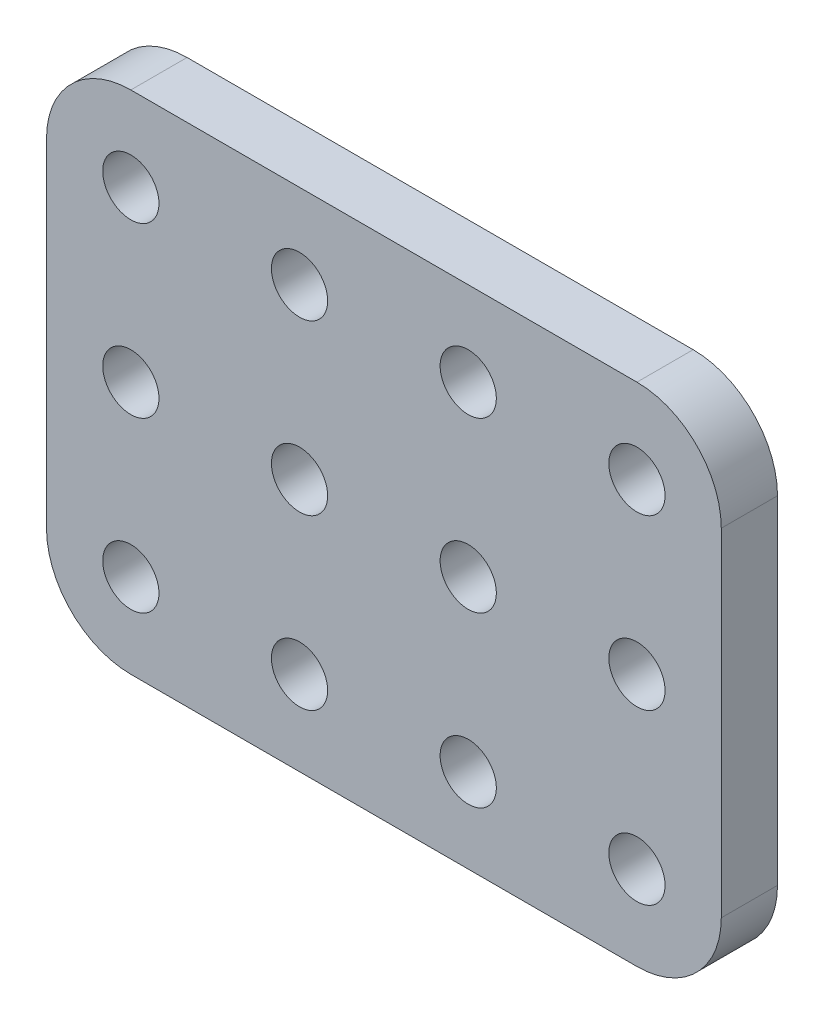
ISO-10303-21;
HEADER;
FILE_DESCRIPTION(('STEP AP214'),'2;1');
FILE_NAME('part.step','',(''),(''),'','','');
FILE_SCHEMA(('AUTOMOTIVE_DESIGN { 1 0 10303 214 1 1 1 1 }'));
ENDSEC;
DATA;
#1=APPLICATION_CONTEXT('core data for automotive mechanical design processes');
#2=APPLICATION_PROTOCOL_DEFINITION('international standard','automotive_design',2000,#1);
#3=PRODUCT_CONTEXT('',#1,'mechanical');
#4=PRODUCT('Part','Part','',(#3));
#5=PRODUCT_RELATED_PRODUCT_CATEGORY('part','',(#4));
#6=PRODUCT_DEFINITION_FORMATION('','',#4);
#7=PRODUCT_DEFINITION_CONTEXT('part definition',#1,'design');
#8=PRODUCT_DEFINITION('design','',#6,#7);
#9=PRODUCT_DEFINITION_SHAPE('','',#8);
#10=(LENGTH_UNIT() NAMED_UNIT(*) SI_UNIT(.MILLI.,.METRE.));
#11=(NAMED_UNIT(*) PLANE_ANGLE_UNIT() SI_UNIT($,.RADIAN.));
#12=(NAMED_UNIT(*) SI_UNIT($,.STERADIAN.) SOLID_ANGLE_UNIT());
#13=UNCERTAINTY_MEASURE_WITH_UNIT(LENGTH_MEASURE(1.E-05),#10,'distance_accuracy_value','');
#14=(GEOMETRIC_REPRESENTATION_CONTEXT(3) GLOBAL_UNCERTAINTY_ASSIGNED_CONTEXT((#13)) GLOBAL_UNIT_ASSIGNED_CONTEXT((#10,
#11,#12)) REPRESENTATION_CONTEXT('',''));
#15=CARTESIAN_POINT('',(0.,0.,0.));
#16=DIRECTION('',(0.,0.,1.));
#17=DIRECTION('',(1.,0.,0.));
#18=AXIS2_PLACEMENT_3D('',#15,#16,#17);
#19=CARTESIAN_POINT('',(-101.443383637,92.056539338,3.));
#20=DIRECTION('',(0.,0.,1.));
#21=DIRECTION('',(1.,0.,0.));
#22=AXIS2_PLACEMENT_3D('',#19,#20,#21);
#23=PLANE('',#22);
#24=CARTESIAN_POINT('',(-83.443383637,74.056539338,3.));
#25=DIRECTION('',(0.,0.,1.));
#26=DIRECTION('',(1.,0.,0.));
#27=AXIS2_PLACEMENT_3D('',#24,#25,#26);
#28=CIRCLE('',#27,1.5);
#29=CARTESIAN_POINT('',(-81.943383637,74.056539338,3.));
#30=VERTEX_POINT('',#29);
#31=EDGE_CURVE('E236',#30,#30,#28,.T.);
#32=ORIENTED_EDGE('',*,*,#31,.F.);
#33=EDGE_LOOP('',(#32));
#34=FACE_BOUND('',#33,.T.);
#35=CARTESIAN_POINT('',(-101.443383637,74.056539338,3.));
#36=DIRECTION('',(0.,0.,1.));
#37=DIRECTION('',(1.,0.,0.));
#38=AXIS2_PLACEMENT_3D('',#35,#36,#37);
#39=CIRCLE('',#38,1.5);
#40=CARTESIAN_POINT('',(-99.943383637,74.056539338,3.));
#41=VERTEX_POINT('',#40);
#42=EDGE_CURVE('E224',#41,#41,#39,.T.);
#43=ORIENTED_EDGE('',*,*,#42,.F.);
#44=EDGE_LOOP('',(#43));
#45=FACE_BOUND('',#44,.T.);
#46=CARTESIAN_POINT('',(-83.443383637,83.056539338,3.));
#47=DIRECTION('',(0.,0.,1.));
#48=DIRECTION('',(1.,0.,0.));
#49=AXIS2_PLACEMENT_3D('',#46,#47,#48);
#50=CIRCLE('',#49,1.5);
#51=CARTESIAN_POINT('',(-81.943383637,83.056539338,3.));
#52=VERTEX_POINT('',#51);
#53=EDGE_CURVE('E212',#52,#52,#50,.T.);
#54=ORIENTED_EDGE('',*,*,#53,.F.);
#55=EDGE_LOOP('',(#54));
#56=FACE_BOUND('',#55,.T.);
#57=CARTESIAN_POINT('',(-101.443383637,83.056539338,3.));
#58=DIRECTION('',(0.,0.,1.));
#59=DIRECTION('',(1.,0.,0.));
#60=AXIS2_PLACEMENT_3D('',#57,#58,#59);
#61=CIRCLE('',#60,1.5);
#62=CARTESIAN_POINT('',(-99.943383637,83.056539338,3.));
#63=VERTEX_POINT('',#62);
#64=EDGE_CURVE('E200',#63,#63,#61,.T.);
#65=ORIENTED_EDGE('',*,*,#64,.F.);
#66=EDGE_LOOP('',(#65));
#67=FACE_BOUND('',#66,.T.);
#68=CARTESIAN_POINT('',(-83.443383637,92.056539338,3.));
#69=DIRECTION('',(0.,0.,1.));
#70=DIRECTION('',(1.,0.,0.));
#71=AXIS2_PLACEMENT_3D('',#68,#69,#70);
#72=CIRCLE('',#71,1.5);
#73=CARTESIAN_POINT('',(-81.943383637,92.056539338,3.));
#74=VERTEX_POINT('',#73);
#75=EDGE_CURVE('E188',#74,#74,#72,.T.);
#76=ORIENTED_EDGE('',*,*,#75,.F.);
#77=EDGE_LOOP('',(#76));
#78=FACE_BOUND('',#77,.T.);
#79=CARTESIAN_POINT('',(-101.443383637,92.056539338,3.));
#80=DIRECTION('',(0.,0.,1.));
#81=DIRECTION('',(1.,0.,0.));
#82=AXIS2_PLACEMENT_3D('',#79,#80,#81);
#83=CIRCLE('',#82,1.5);
#84=CARTESIAN_POINT('',(-99.943383637,92.056539338,3.));
#85=VERTEX_POINT('',#84);
#86=EDGE_CURVE('E134',#85,#85,#83,.T.);
#87=ORIENTED_EDGE('',*,*,#86,.F.);
#88=EDGE_LOOP('',(#87));
#89=FACE_BOUND('',#88,.T.);
#90=CARTESIAN_POINT('',(-101.443383637,92.056539338,3.));
#91=DIRECTION('',(0.,0.,1.));
#92=DIRECTION('',(1.,0.,0.));
#93=AXIS2_PLACEMENT_3D('',#90,#91,#92);
#94=CIRCLE('',#93,4.5);
#95=CARTESIAN_POINT('',(-101.443383637,96.556539338,3.));
#96=VERTEX_POINT('',#95);
#97=CARTESIAN_POINT('',(-105.943383637,92.056539338,3.));
#98=VERTEX_POINT('',#97);
#99=EDGE_CURVE('E145',#96,#98,#94,.T.);
#100=ORIENTED_EDGE('',*,*,#99,.T.);
#101=DIRECTION('',(0.,-1.,0.));
#102=VECTOR('',#101,1.);
#103=CARTESIAN_POINT('',(-105.943383637,92.056539338,3.));
#104=LINE('',#103,#102);
#105=CARTESIAN_POINT('',(-105.943383637,74.056539338,3.));
#106=VERTEX_POINT('',#105);
#107=EDGE_CURVE('E93',#98,#106,#104,.T.);
#108=ORIENTED_EDGE('',*,*,#107,.T.);
#109=CARTESIAN_POINT('',(-101.443383637,74.056539338,3.));
#110=DIRECTION('',(0.,0.,1.));
#111=DIRECTION('',(1.,0.,0.));
#112=AXIS2_PLACEMENT_3D('',#109,#110,#111);
#113=CIRCLE('',#112,4.5);
#114=CARTESIAN_POINT('',(-101.443383637,69.556539338,3.));
#115=VERTEX_POINT('',#114);
#116=EDGE_CURVE('E160',#106,#115,#113,.T.);
#117=ORIENTED_EDGE('',*,*,#116,.T.);
#118=DIRECTION('',(1.,0.,0.));
#119=VECTOR('',#118,1.);
#120=CARTESIAN_POINT('',(-101.443383637,69.556539338,3.));
#121=LINE('',#120,#119);
#122=CARTESIAN_POINT('',(-74.443383637,69.556539338,3.));
#123=VERTEX_POINT('',#122);
#124=EDGE_CURVE('E173',#115,#123,#121,.T.);
#125=ORIENTED_EDGE('',*,*,#124,.T.);
#126=CARTESIAN_POINT('',(-74.443383637,74.056539338,3.));
#127=DIRECTION('',(0.,0.,1.));
#128=DIRECTION('',(1.,0.,0.));
#129=AXIS2_PLACEMENT_3D('',#126,#127,#128);
#130=CIRCLE('',#129,4.5);
#131=CARTESIAN_POINT('',(-69.943383637,74.056539338,3.));
#132=VERTEX_POINT('',#131);
#133=EDGE_CURVE('E112',#123,#132,#130,.T.);
#134=ORIENTED_EDGE('',*,*,#133,.T.);
#135=DIRECTION('',(0.,1.,0.));
#136=VECTOR('',#135,1.);
#137=CARTESIAN_POINT('',(-69.943383637,74.056539338,3.));
#138=LINE('',#137,#136);
#139=CARTESIAN_POINT('',(-69.943383637,92.056539338,3.));
#140=VERTEX_POINT('',#139);
#141=EDGE_CURVE('E106',#132,#140,#138,.T.);
#142=ORIENTED_EDGE('',*,*,#141,.T.);
#143=CARTESIAN_POINT('',(-74.443383637,92.056539338,3.));
#144=DIRECTION('',(0.,0.,1.));
#145=DIRECTION('',(1.,0.,0.));
#146=AXIS2_PLACEMENT_3D('',#143,#144,#145);
#147=CIRCLE('',#146,4.5);
#148=CARTESIAN_POINT('',(-74.443383637,96.556539338,3.));
#149=VERTEX_POINT('',#148);
#150=EDGE_CURVE('E110',#140,#149,#147,.T.);
#151=ORIENTED_EDGE('',*,*,#150,.T.);
#152=DIRECTION('',(-1.,0.,0.));
#153=VECTOR('',#152,1.);
#154=CARTESIAN_POINT('',(-74.443383637,96.556539338,3.));
#155=LINE('',#154,#153);
#156=EDGE_CURVE('E50',#149,#96,#155,.T.);
#157=ORIENTED_EDGE('',*,*,#156,.T.);
#158=EDGE_LOOP('',(#100,#108,#117,#125,#134,#142,#151,#157));
#159=FACE_BOUND('',#158,.T.);
#160=CARTESIAN_POINT('',(-92.443383637,92.056539338,3.));
#161=DIRECTION('',(0.,0.,1.));
#162=DIRECTION('',(1.,0.,0.));
#163=AXIS2_PLACEMENT_3D('',#160,#161,#162);
#164=CIRCLE('',#163,1.5);
#165=CARTESIAN_POINT('',(-90.943383637,92.056539338,3.));
#166=VERTEX_POINT('',#165);
#167=EDGE_CURVE('E182',#166,#166,#164,.T.);
#168=ORIENTED_EDGE('',*,*,#167,.F.);
#169=EDGE_LOOP('',(#168));
#170=FACE_BOUND('',#169,.T.);
#171=CARTESIAN_POINT('',(-74.443383637,92.056539338,3.));
#172=DIRECTION('',(0.,0.,1.));
#173=DIRECTION('',(1.,0.,0.));
#174=AXIS2_PLACEMENT_3D('',#171,#172,#173);
#175=CIRCLE('',#174,1.5);
#176=CARTESIAN_POINT('',(-72.943383637,92.056539338,3.));
#177=VERTEX_POINT('',#176);
#178=EDGE_CURVE('E194',#177,#177,#175,.T.);
#179=ORIENTED_EDGE('',*,*,#178,.F.);
#180=EDGE_LOOP('',(#179));
#181=FACE_BOUND('',#180,.T.);
#182=CARTESIAN_POINT('',(-92.443383637,83.056539338,3.));
#183=DIRECTION('',(0.,0.,1.));
#184=DIRECTION('',(1.,0.,0.));
#185=AXIS2_PLACEMENT_3D('',#182,#183,#184);
#186=CIRCLE('',#185,1.5);
#187=CARTESIAN_POINT('',(-90.943383637,83.056539338,3.));
#188=VERTEX_POINT('',#187);
#189=EDGE_CURVE('E206',#188,#188,#186,.T.);
#190=ORIENTED_EDGE('',*,*,#189,.F.);
#191=EDGE_LOOP('',(#190));
#192=FACE_BOUND('',#191,.T.);
#193=CARTESIAN_POINT('',(-74.443383637,83.056539338,3.));
#194=DIRECTION('',(0.,0.,1.));
#195=DIRECTION('',(1.,0.,0.));
#196=AXIS2_PLACEMENT_3D('',#193,#194,#195);
#197=CIRCLE('',#196,1.5);
#198=CARTESIAN_POINT('',(-72.943383637,83.056539338,3.));
#199=VERTEX_POINT('',#198);
#200=EDGE_CURVE('E218',#199,#199,#197,.T.);
#201=ORIENTED_EDGE('',*,*,#200,.F.);
#202=EDGE_LOOP('',(#201));
#203=FACE_BOUND('',#202,.T.);
#204=CARTESIAN_POINT('',(-92.443383637,74.056539338,3.));
#205=DIRECTION('',(0.,0.,1.));
#206=DIRECTION('',(1.,0.,0.));
#207=AXIS2_PLACEMENT_3D('',#204,#205,#206);
#208=CIRCLE('',#207,1.5);
#209=CARTESIAN_POINT('',(-90.943383637,74.056539338,3.));
#210=VERTEX_POINT('',#209);
#211=EDGE_CURVE('E230',#210,#210,#208,.T.);
#212=ORIENTED_EDGE('',*,*,#211,.F.);
#213=EDGE_LOOP('',(#212));
#214=FACE_BOUND('',#213,.T.);
#215=CARTESIAN_POINT('',(-74.443383637,74.056539338,3.));
#216=DIRECTION('',(0.,0.,1.));
#217=DIRECTION('',(1.,0.,0.));
#218=AXIS2_PLACEMENT_3D('',#215,#216,#217);
#219=CIRCLE('',#218,1.5);
#220=CARTESIAN_POINT('',(-72.943383637,74.056539338,3.));
#221=VERTEX_POINT('',#220);
#222=EDGE_CURVE('E242',#221,#221,#219,.T.);
#223=ORIENTED_EDGE('',*,*,#222,.F.);
#224=EDGE_LOOP('',(#223));
#225=FACE_BOUND('',#224,.T.);
#226=ADVANCED_FACE('F33',(#34,#45,#56,#67,#78,#89,#159,#170,#181,#192,#203,#214,#225),#23,.T.);
#227=CARTESIAN_POINT('',(-101.443383637,92.056539338,0.));
#228=DIRECTION('',(0.,0.,1.));
#229=DIRECTION('',(1.,0.,0.));
#230=AXIS2_PLACEMENT_3D('',#227,#228,#229);
#231=PLANE('',#230);
#232=CARTESIAN_POINT('',(-83.443383637,74.056539338,0.));
#233=DIRECTION('',(0.,0.,1.));
#234=DIRECTION('',(1.,0.,0.));
#235=AXIS2_PLACEMENT_3D('',#232,#233,#234);
#236=CIRCLE('',#235,1.5);
#237=CARTESIAN_POINT('',(-81.943383637,74.056539338,0.));
#238=VERTEX_POINT('',#237);
#239=EDGE_CURVE('E239',#238,#238,#236,.T.);
#240=ORIENTED_EDGE('',*,*,#239,.T.);
#241=EDGE_LOOP('',(#240));
#242=FACE_BOUND('',#241,.T.);
#243=CARTESIAN_POINT('',(-101.443383637,74.056539338,0.));
#244=DIRECTION('',(0.,0.,1.));
#245=DIRECTION('',(1.,0.,0.));
#246=AXIS2_PLACEMENT_3D('',#243,#244,#245);
#247=CIRCLE('',#246,1.5);
#248=CARTESIAN_POINT('',(-99.943383637,74.056539338,0.));
#249=VERTEX_POINT('',#248);
#250=EDGE_CURVE('E227',#249,#249,#247,.T.);
#251=ORIENTED_EDGE('',*,*,#250,.T.);
#252=EDGE_LOOP('',(#251));
#253=FACE_BOUND('',#252,.T.);
#254=CARTESIAN_POINT('',(-83.443383637,83.056539338,0.));
#255=DIRECTION('',(0.,0.,1.));
#256=DIRECTION('',(1.,0.,0.));
#257=AXIS2_PLACEMENT_3D('',#254,#255,#256);
#258=CIRCLE('',#257,1.5);
#259=CARTESIAN_POINT('',(-81.943383637,83.056539338,0.));
#260=VERTEX_POINT('',#259);
#261=EDGE_CURVE('E215',#260,#260,#258,.T.);
#262=ORIENTED_EDGE('',*,*,#261,.T.);
#263=EDGE_LOOP('',(#262));
#264=FACE_BOUND('',#263,.T.);
#265=CARTESIAN_POINT('',(-101.443383637,83.056539338,0.));
#266=DIRECTION('',(0.,0.,1.));
#267=DIRECTION('',(1.,0.,0.));
#268=AXIS2_PLACEMENT_3D('',#265,#266,#267);
#269=CIRCLE('',#268,1.5);
#270=CARTESIAN_POINT('',(-99.943383637,83.056539338,0.));
#271=VERTEX_POINT('',#270);
#272=EDGE_CURVE('E203',#271,#271,#269,.T.);
#273=ORIENTED_EDGE('',*,*,#272,.T.);
#274=EDGE_LOOP('',(#273));
#275=FACE_BOUND('',#274,.T.);
#276=CARTESIAN_POINT('',(-83.443383637,92.056539338,0.));
#277=DIRECTION('',(0.,0.,1.));
#278=DIRECTION('',(1.,0.,0.));
#279=AXIS2_PLACEMENT_3D('',#276,#277,#278);
#280=CIRCLE('',#279,1.5);
#281=CARTESIAN_POINT('',(-81.943383637,92.056539338,0.));
#282=VERTEX_POINT('',#281);
#283=EDGE_CURVE('E191',#282,#282,#280,.T.);
#284=ORIENTED_EDGE('',*,*,#283,.T.);
#285=EDGE_LOOP('',(#284));
#286=FACE_BOUND('',#285,.T.);
#287=CARTESIAN_POINT('',(-101.443383637,92.056539338,0.));
#288=DIRECTION('',(0.,0.,1.));
#289=DIRECTION('',(1.,0.,0.));
#290=AXIS2_PLACEMENT_3D('',#287,#288,#289);
#291=CIRCLE('',#290,1.5);
#292=CARTESIAN_POINT('',(-99.943383637,92.056539338,0.));
#293=VERTEX_POINT('',#292);
#294=EDGE_CURVE('E179',#293,#293,#291,.T.);
#295=ORIENTED_EDGE('',*,*,#294,.T.);
#296=EDGE_LOOP('',(#295));
#297=FACE_BOUND('',#296,.T.);
#298=CARTESIAN_POINT('',(-101.443383637,92.056539338,0.));
#299=DIRECTION('',(0.,0.,1.));
#300=DIRECTION('',(1.,0.,0.));
#301=AXIS2_PLACEMENT_3D('',#298,#299,#300);
#302=CIRCLE('',#301,4.5);
#303=CARTESIAN_POINT('',(-101.443383637,96.556539338,0.));
#304=VERTEX_POINT('',#303);
#305=CARTESIAN_POINT('',(-105.943383637,92.056539338,0.));
#306=VERTEX_POINT('',#305);
#307=EDGE_CURVE('E130',#304,#306,#302,.T.);
#308=ORIENTED_EDGE('',*,*,#307,.F.);
#309=DIRECTION('',(-1.,0.,0.));
#310=VECTOR('',#309,1.);
#311=CARTESIAN_POINT('',(-74.443383637,96.556539338,0.));
#312=LINE('',#311,#310);
#313=CARTESIAN_POINT('',(-74.443383637,96.556539338,0.));
#314=VERTEX_POINT('',#313);
#315=EDGE_CURVE('E85',#314,#304,#312,.T.);
#316=ORIENTED_EDGE('',*,*,#315,.F.);
#317=CARTESIAN_POINT('',(-74.443383637,92.056539338,0.));
#318=DIRECTION('',(0.,0.,1.));
#319=DIRECTION('',(1.,0.,0.));
#320=AXIS2_PLACEMENT_3D('',#317,#318,#319);
#321=CIRCLE('',#320,4.5);
#322=CARTESIAN_POINT('',(-69.943383637,92.056539338,0.));
#323=VERTEX_POINT('',#322);
#324=EDGE_CURVE('E79',#323,#314,#321,.T.);
#325=ORIENTED_EDGE('',*,*,#324,.F.);
#326=DIRECTION('',(0.,1.,0.));
#327=VECTOR('',#326,1.);
#328=CARTESIAN_POINT('',(-69.943383637,74.056539338,0.));
#329=LINE('',#328,#327);
#330=CARTESIAN_POINT('',(-69.943383637,74.056539338,0.));
#331=VERTEX_POINT('',#330);
#332=EDGE_CURVE('E120',#331,#323,#329,.T.);
#333=ORIENTED_EDGE('',*,*,#332,.F.);
#334=CARTESIAN_POINT('',(-74.443383637,74.056539338,0.));
#335=DIRECTION('',(0.,0.,1.));
#336=DIRECTION('',(1.,0.,0.));
#337=AXIS2_PLACEMENT_3D('',#334,#335,#336);
#338=CIRCLE('',#337,4.5);
#339=CARTESIAN_POINT('',(-74.443383637,69.556539338,0.));
#340=VERTEX_POINT('',#339);
#341=EDGE_CURVE('E140',#340,#331,#338,.T.);
#342=ORIENTED_EDGE('',*,*,#341,.F.);
#343=DIRECTION('',(1.,0.,0.));
#344=VECTOR('',#343,1.);
#345=CARTESIAN_POINT('',(-101.443383637,69.556539338,0.));
#346=LINE('',#345,#344);
#347=CARTESIAN_POINT('',(-101.443383637,69.556539338,0.));
#348=VERTEX_POINT('',#347);
#349=EDGE_CURVE('E138',#348,#340,#346,.T.);
#350=ORIENTED_EDGE('',*,*,#349,.F.);
#351=CARTESIAN_POINT('',(-101.443383637,74.056539338,0.));
#352=DIRECTION('',(0.,0.,1.));
#353=DIRECTION('',(1.,0.,0.));
#354=AXIS2_PLACEMENT_3D('',#351,#352,#353);
#355=CIRCLE('',#354,4.5);
#356=CARTESIAN_POINT('',(-105.943383637,74.056539338,0.));
#357=VERTEX_POINT('',#356);
#358=EDGE_CURVE('E136',#357,#348,#355,.T.);
#359=ORIENTED_EDGE('',*,*,#358,.F.);
#360=DIRECTION('',(0.,-1.,0.));
#361=VECTOR('',#360,1.);
#362=CARTESIAN_POINT('',(-105.943383637,92.056539338,0.));
#363=LINE('',#362,#361);
#364=EDGE_CURVE('E133',#306,#357,#363,.T.);
#365=ORIENTED_EDGE('',*,*,#364,.F.);
#366=EDGE_LOOP('',(#308,#316,#325,#333,#342,#350,#359,#365));
#367=FACE_BOUND('',#366,.T.);
#368=CARTESIAN_POINT('',(-92.443383637,92.056539338,0.));
#369=DIRECTION('',(0.,0.,1.));
#370=DIRECTION('',(1.,0.,0.));
#371=AXIS2_PLACEMENT_3D('',#368,#369,#370);
#372=CIRCLE('',#371,1.5);
#373=CARTESIAN_POINT('',(-90.943383637,92.056539338,0.));
#374=VERTEX_POINT('',#373);
#375=EDGE_CURVE('E185',#374,#374,#372,.T.);
#376=ORIENTED_EDGE('',*,*,#375,.T.);
#377=EDGE_LOOP('',(#376));
#378=FACE_BOUND('',#377,.T.);
#379=CARTESIAN_POINT('',(-74.443383637,92.056539338,0.));
#380=DIRECTION('',(0.,0.,1.));
#381=DIRECTION('',(1.,0.,0.));
#382=AXIS2_PLACEMENT_3D('',#379,#380,#381);
#383=CIRCLE('',#382,1.5);
#384=CARTESIAN_POINT('',(-72.943383637,92.056539338,0.));
#385=VERTEX_POINT('',#384);
#386=EDGE_CURVE('E197',#385,#385,#383,.T.);
#387=ORIENTED_EDGE('',*,*,#386,.T.);
#388=EDGE_LOOP('',(#387));
#389=FACE_BOUND('',#388,.T.);
#390=CARTESIAN_POINT('',(-92.443383637,83.056539338,0.));
#391=DIRECTION('',(0.,0.,1.));
#392=DIRECTION('',(1.,0.,0.));
#393=AXIS2_PLACEMENT_3D('',#390,#391,#392);
#394=CIRCLE('',#393,1.5);
#395=CARTESIAN_POINT('',(-90.943383637,83.056539338,0.));
#396=VERTEX_POINT('',#395);
#397=EDGE_CURVE('E209',#396,#396,#394,.T.);
#398=ORIENTED_EDGE('',*,*,#397,.T.);
#399=EDGE_LOOP('',(#398));
#400=FACE_BOUND('',#399,.T.);
#401=CARTESIAN_POINT('',(-74.443383637,83.056539338,0.));
#402=DIRECTION('',(0.,0.,1.));
#403=DIRECTION('',(1.,0.,0.));
#404=AXIS2_PLACEMENT_3D('',#401,#402,#403);
#405=CIRCLE('',#404,1.5);
#406=CARTESIAN_POINT('',(-72.943383637,83.056539338,0.));
#407=VERTEX_POINT('',#406);
#408=EDGE_CURVE('E221',#407,#407,#405,.T.);
#409=ORIENTED_EDGE('',*,*,#408,.T.);
#410=EDGE_LOOP('',(#409));
#411=FACE_BOUND('',#410,.T.);
#412=CARTESIAN_POINT('',(-92.443383637,74.056539338,0.));
#413=DIRECTION('',(0.,0.,1.));
#414=DIRECTION('',(1.,0.,0.));
#415=AXIS2_PLACEMENT_3D('',#412,#413,#414);
#416=CIRCLE('',#415,1.5);
#417=CARTESIAN_POINT('',(-90.943383637,74.056539338,0.));
#418=VERTEX_POINT('',#417);
#419=EDGE_CURVE('E233',#418,#418,#416,.T.);
#420=ORIENTED_EDGE('',*,*,#419,.T.);
#421=EDGE_LOOP('',(#420));
#422=FACE_BOUND('',#421,.T.);
#423=CARTESIAN_POINT('',(-74.443383637,74.056539338,0.));
#424=DIRECTION('',(0.,0.,1.));
#425=DIRECTION('',(1.,0.,0.));
#426=AXIS2_PLACEMENT_3D('',#423,#424,#425);
#427=CIRCLE('',#426,1.5);
#428=CARTESIAN_POINT('',(-72.943383637,74.056539338,0.));
#429=VERTEX_POINT('',#428);
#430=EDGE_CURVE('E245',#429,#429,#427,.T.);
#431=ORIENTED_EDGE('',*,*,#430,.T.);
#432=EDGE_LOOP('',(#431));
#433=FACE_BOUND('',#432,.T.);
#434=ADVANCED_FACE('F164',(#242,#253,#264,#275,#286,#297,#367,#378,#389,#400,#411,#422,#433),
#231,.F.);
#435=CARTESIAN_POINT('',(-101.443383637,92.056539338,3.));
#436=DIRECTION('',(0.,0.,-1.));
#437=DIRECTION('',(-1.,0.,0.));
#438=AXIS2_PLACEMENT_3D('',#435,#436,#437);
#439=CYLINDRICAL_SURFACE('',#438,4.5);
#440=ORIENTED_EDGE('',*,*,#307,.T.);
#441=DIRECTION('',(0.,0.,-1.));
#442=VECTOR('',#441,1.);
#443=CARTESIAN_POINT('',(-105.943383637,92.056539338,3.));
#444=LINE('',#443,#442);
#445=EDGE_CURVE('E11',#98,#306,#444,.T.);
#446=ORIENTED_EDGE('',*,*,#445,.F.);
#447=ORIENTED_EDGE('',*,*,#99,.F.);
#448=DIRECTION('',(0.,0.,-1.));
#449=VECTOR('',#448,1.);
#450=CARTESIAN_POINT('',(-101.443383637,96.556539338,3.));
#451=LINE('',#450,#449);
#452=EDGE_CURVE('E126',#96,#304,#451,.T.);
#453=ORIENTED_EDGE('',*,*,#452,.T.);
#454=EDGE_LOOP('',(#440,#446,#447,#453));
#455=FACE_BOUND('',#454,.T.);
#456=ADVANCED_FACE('F35',(#455),#439,.T.);
#457=CARTESIAN_POINT('',(-105.943383637,92.056539338,3.));
#458=DIRECTION('',(1.,0.,0.));
#459=DIRECTION('',(0.,0.,-1.));
#460=AXIS2_PLACEMENT_3D('',#457,#458,#459);
#461=PLANE('',#460);
#462=ORIENTED_EDGE('',*,*,#364,.T.);
#463=DIRECTION('',(0.,0.,-1.));
#464=VECTOR('',#463,1.);
#465=CARTESIAN_POINT('',(-105.943383637,74.056539338,3.));
#466=LINE('',#465,#464);
#467=EDGE_CURVE('E42',#106,#357,#466,.T.);
#468=ORIENTED_EDGE('',*,*,#467,.F.);
#469=ORIENTED_EDGE('',*,*,#107,.F.);
#470=ORIENTED_EDGE('',*,*,#445,.T.);
#471=EDGE_LOOP('',(#462,#468,#469,#470));
#472=FACE_BOUND('',#471,.T.);
#473=ADVANCED_FACE('F280',(#472),#461,.F.);
#474=CARTESIAN_POINT('',(-101.443383637,74.056539338,3.));
#475=DIRECTION('',(0.,0.,-1.));
#476=DIRECTION('',(-1.,0.,0.));
#477=AXIS2_PLACEMENT_3D('',#474,#475,#476);
#478=CYLINDRICAL_SURFACE('',#477,4.5);
#479=ORIENTED_EDGE('',*,*,#358,.T.);
#480=DIRECTION('',(0.,0.,-1.));
#481=VECTOR('',#480,1.);
#482=CARTESIAN_POINT('',(-101.443383637,69.556539338,3.));
#483=LINE('',#482,#481);
#484=EDGE_CURVE('E152',#115,#348,#483,.T.);
#485=ORIENTED_EDGE('',*,*,#484,.F.);
#486=ORIENTED_EDGE('',*,*,#116,.F.);
#487=ORIENTED_EDGE('',*,*,#467,.T.);
#488=EDGE_LOOP('',(#479,#485,#486,#487));
#489=FACE_BOUND('',#488,.T.);
#490=ADVANCED_FACE('F158',(#489),#478,.T.);
#491=CARTESIAN_POINT('',(-101.443383637,69.556539338,3.));
#492=DIRECTION('',(0.,1.,0.));
#493=DIRECTION('',(0.,0.,1.));
#494=AXIS2_PLACEMENT_3D('',#491,#492,#493);
#495=PLANE('',#494);
#496=ORIENTED_EDGE('',*,*,#349,.T.);
#497=DIRECTION('',(0.,0.,-1.));
#498=VECTOR('',#497,1.);
#499=CARTESIAN_POINT('',(-74.443383637,69.556539338,3.));
#500=LINE('',#499,#498);
#501=EDGE_CURVE('E149',#123,#340,#500,.T.);
#502=ORIENTED_EDGE('',*,*,#501,.F.);
#503=ORIENTED_EDGE('',*,*,#124,.F.);
#504=ORIENTED_EDGE('',*,*,#484,.T.);
#505=EDGE_LOOP('',(#496,#502,#503,#504));
#506=FACE_BOUND('',#505,.T.);
#507=ADVANCED_FACE('F169',(#506),#495,.F.);
#508=CARTESIAN_POINT('',(-74.443383637,74.056539338,3.));
#509=DIRECTION('',(0.,0.,-1.));
#510=DIRECTION('',(-1.,0.,0.));
#511=AXIS2_PLACEMENT_3D('',#508,#509,#510);
#512=CYLINDRICAL_SURFACE('',#511,4.5);
#513=ORIENTED_EDGE('',*,*,#341,.T.);
#514=DIRECTION('',(0.,0.,-1.));
#515=VECTOR('',#514,1.);
#516=CARTESIAN_POINT('',(-69.943383637,74.056539338,3.));
#517=LINE('',#516,#515);
#518=EDGE_CURVE('E121',#132,#331,#517,.T.);
#519=ORIENTED_EDGE('',*,*,#518,.F.);
#520=ORIENTED_EDGE('',*,*,#133,.F.);
#521=ORIENTED_EDGE('',*,*,#501,.T.);
#522=EDGE_LOOP('',(#513,#519,#520,#521));
#523=FACE_BOUND('',#522,.T.);
#524=ADVANCED_FACE('F172',(#523),#512,.T.);
#525=CARTESIAN_POINT('',(-69.943383637,74.056539338,3.));
#526=DIRECTION('',(-1.,0.,0.));
#527=DIRECTION('',(0.,0.,1.));
#528=AXIS2_PLACEMENT_3D('',#525,#526,#527);
#529=PLANE('',#528);
#530=ORIENTED_EDGE('',*,*,#332,.T.);
#531=DIRECTION('',(0.,0.,-1.));
#532=VECTOR('',#531,1.);
#533=CARTESIAN_POINT('',(-69.943383637,92.056539338,3.));
#534=LINE('',#533,#532);
#535=EDGE_CURVE('E117',#140,#323,#534,.T.);
#536=ORIENTED_EDGE('',*,*,#535,.F.);
#537=ORIENTED_EDGE('',*,*,#141,.F.);
#538=ORIENTED_EDGE('',*,*,#518,.T.);
#539=EDGE_LOOP('',(#530,#536,#537,#538));
#540=FACE_BOUND('',#539,.T.);
#541=ADVANCED_FACE('F118',(#540),#529,.F.);
#542=CARTESIAN_POINT('',(-74.443383637,92.056539338,3.));
#543=DIRECTION('',(0.,0.,-1.));
#544=DIRECTION('',(-1.,0.,0.));
#545=AXIS2_PLACEMENT_3D('',#542,#543,#544);
#546=CYLINDRICAL_SURFACE('',#545,4.5);
#547=ORIENTED_EDGE('',*,*,#324,.T.);
#548=DIRECTION('',(0.,0.,-1.));
#549=VECTOR('',#548,1.);
#550=CARTESIAN_POINT('',(-74.443383637,96.556539338,3.));
#551=LINE('',#550,#549);
#552=EDGE_CURVE('E122',#149,#314,#551,.T.);
#553=ORIENTED_EDGE('',*,*,#552,.F.);
#554=ORIENTED_EDGE('',*,*,#150,.F.);
#555=ORIENTED_EDGE('',*,*,#535,.T.);
#556=EDGE_LOOP('',(#547,#553,#554,#555));
#557=FACE_BOUND('',#556,.T.);
#558=ADVANCED_FACE('F124',(#557),#546,.T.);
#559=CARTESIAN_POINT('',(-74.443383637,96.556539338,3.));
#560=DIRECTION('',(0.,-1.,0.));
#561=DIRECTION('',(0.,0.,-1.));
#562=AXIS2_PLACEMENT_3D('',#559,#560,#561);
#563=PLANE('',#562);
#564=ORIENTED_EDGE('',*,*,#315,.T.);
#565=ORIENTED_EDGE('',*,*,#452,.F.);
#566=ORIENTED_EDGE('',*,*,#156,.F.);
#567=ORIENTED_EDGE('',*,*,#552,.T.);
#568=EDGE_LOOP('',(#564,#565,#566,#567));
#569=FACE_BOUND('',#568,.T.);
#570=ADVANCED_FACE('F268',(#569),#563,.F.);
#571=CARTESIAN_POINT('',(-101.443383637,92.056539338,3.));
#572=DIRECTION('',(0.,0.,-1.));
#573=DIRECTION('',(-1.,0.,0.));
#574=AXIS2_PLACEMENT_3D('',#571,#572,#573);
#575=CYLINDRICAL_SURFACE('',#574,1.5);
#576=ORIENTED_EDGE('',*,*,#86,.T.);
#577=EDGE_LOOP('',(#576));
#578=FACE_BOUND('',#577,.T.);
#579=ORIENTED_EDGE('',*,*,#294,.F.);
#580=EDGE_LOOP('',(#579));
#581=FACE_BOUND('',#580,.T.);
#582=ADVANCED_FACE('F265',(#578,#581),#575,.F.);
#583=CARTESIAN_POINT('',(-92.443383637,92.056539338,3.));
#584=DIRECTION('',(0.,0.,-1.));
#585=DIRECTION('',(-1.,0.,0.));
#586=AXIS2_PLACEMENT_3D('',#583,#584,#585);
#587=CYLINDRICAL_SURFACE('',#586,1.5);
#588=ORIENTED_EDGE('',*,*,#167,.T.);
#589=EDGE_LOOP('',(#588));
#590=FACE_BOUND('',#589,.T.);
#591=ORIENTED_EDGE('',*,*,#375,.F.);
#592=EDGE_LOOP('',(#591));
#593=FACE_BOUND('',#592,.T.);
#594=ADVANCED_FACE('F344',(#590,#593),#587,.F.);
#595=CARTESIAN_POINT('',(-83.443383637,92.056539338,3.));
#596=DIRECTION('',(0.,0.,-1.));
#597=DIRECTION('',(-1.,0.,0.));
#598=AXIS2_PLACEMENT_3D('',#595,#596,#597);
#599=CYLINDRICAL_SURFACE('',#598,1.5);
#600=ORIENTED_EDGE('',*,*,#75,.T.);
#601=EDGE_LOOP('',(#600));
#602=FACE_BOUND('',#601,.T.);
#603=ORIENTED_EDGE('',*,*,#283,.F.);
#604=EDGE_LOOP('',(#603));
#605=FACE_BOUND('',#604,.T.);
#606=ADVANCED_FACE('F352',(#602,#605),#599,.F.);
#607=CARTESIAN_POINT('',(-74.443383637,92.056539338,3.));
#608=DIRECTION('',(0.,0.,-1.));
#609=DIRECTION('',(-1.,0.,0.));
#610=AXIS2_PLACEMENT_3D('',#607,#608,#609);
#611=CYLINDRICAL_SURFACE('',#610,1.5);
#612=ORIENTED_EDGE('',*,*,#178,.T.);
#613=EDGE_LOOP('',(#612));
#614=FACE_BOUND('',#613,.T.);
#615=ORIENTED_EDGE('',*,*,#386,.F.);
#616=EDGE_LOOP('',(#615));
#617=FACE_BOUND('',#616,.T.);
#618=ADVANCED_FACE('F360',(#614,#617),#611,.F.);
#619=CARTESIAN_POINT('',(-101.443383637,83.056539338,3.));
#620=DIRECTION('',(0.,0.,-1.));
#621=DIRECTION('',(-1.,0.,0.));
#622=AXIS2_PLACEMENT_3D('',#619,#620,#621);
#623=CYLINDRICAL_SURFACE('',#622,1.5);
#624=ORIENTED_EDGE('',*,*,#64,.T.);
#625=EDGE_LOOP('',(#624));
#626=FACE_BOUND('',#625,.T.);
#627=ORIENTED_EDGE('',*,*,#272,.F.);
#628=EDGE_LOOP('',(#627));
#629=FACE_BOUND('',#628,.T.);
#630=ADVANCED_FACE('F369',(#626,#629),#623,.F.);
#631=CARTESIAN_POINT('',(-92.443383637,83.056539338,3.));
#632=DIRECTION('',(0.,0.,-1.));
#633=DIRECTION('',(-1.,0.,0.));
#634=AXIS2_PLACEMENT_3D('',#631,#632,#633);
#635=CYLINDRICAL_SURFACE('',#634,1.5);
#636=ORIENTED_EDGE('',*,*,#189,.T.);
#637=EDGE_LOOP('',(#636));
#638=FACE_BOUND('',#637,.T.);
#639=ORIENTED_EDGE('',*,*,#397,.F.);
#640=EDGE_LOOP('',(#639));
#641=FACE_BOUND('',#640,.T.);
#642=ADVANCED_FACE('F378',(#638,#641),#635,.F.);
#643=CARTESIAN_POINT('',(-83.443383637,83.056539338,3.));
#644=DIRECTION('',(0.,0.,-1.));
#645=DIRECTION('',(-1.,0.,0.));
#646=AXIS2_PLACEMENT_3D('',#643,#644,#645);
#647=CYLINDRICAL_SURFACE('',#646,1.5);
#648=ORIENTED_EDGE('',*,*,#53,.T.);
#649=EDGE_LOOP('',(#648));
#650=FACE_BOUND('',#649,.T.);
#651=ORIENTED_EDGE('',*,*,#261,.F.);
#652=EDGE_LOOP('',(#651));
#653=FACE_BOUND('',#652,.T.);
#654=ADVANCED_FACE('F387',(#650,#653),#647,.F.);
#655=CARTESIAN_POINT('',(-74.443383637,83.056539338,3.));
#656=DIRECTION('',(0.,0.,-1.));
#657=DIRECTION('',(-1.,0.,0.));
#658=AXIS2_PLACEMENT_3D('',#655,#656,#657);
#659=CYLINDRICAL_SURFACE('',#658,1.5);
#660=ORIENTED_EDGE('',*,*,#200,.T.);
#661=EDGE_LOOP('',(#660));
#662=FACE_BOUND('',#661,.T.);
#663=ORIENTED_EDGE('',*,*,#408,.F.);
#664=EDGE_LOOP('',(#663));
#665=FACE_BOUND('',#664,.T.);
#666=ADVANCED_FACE('F396',(#662,#665),#659,.F.);
#667=CARTESIAN_POINT('',(-101.443383637,74.056539338,3.));
#668=DIRECTION('',(0.,0.,-1.));
#669=DIRECTION('',(-1.,0.,0.));
#670=AXIS2_PLACEMENT_3D('',#667,#668,#669);
#671=CYLINDRICAL_SURFACE('',#670,1.5);
#672=ORIENTED_EDGE('',*,*,#42,.T.);
#673=EDGE_LOOP('',(#672));
#674=FACE_BOUND('',#673,.T.);
#675=ORIENTED_EDGE('',*,*,#250,.F.);
#676=EDGE_LOOP('',(#675));
#677=FACE_BOUND('',#676,.T.);
#678=ADVANCED_FACE('F405',(#674,#677),#671,.F.);
#679=CARTESIAN_POINT('',(-92.443383637,74.056539338,3.));
#680=DIRECTION('',(0.,0.,-1.));
#681=DIRECTION('',(-1.,0.,0.));
#682=AXIS2_PLACEMENT_3D('',#679,#680,#681);
#683=CYLINDRICAL_SURFACE('',#682,1.5);
#684=ORIENTED_EDGE('',*,*,#211,.T.);
#685=EDGE_LOOP('',(#684));
#686=FACE_BOUND('',#685,.T.);
#687=ORIENTED_EDGE('',*,*,#419,.F.);
#688=EDGE_LOOP('',(#687));
#689=FACE_BOUND('',#688,.T.);
#690=ADVANCED_FACE('F414',(#686,#689),#683,.F.);
#691=CARTESIAN_POINT('',(-83.443383637,74.056539338,3.));
#692=DIRECTION('',(0.,0.,-1.));
#693=DIRECTION('',(-1.,0.,0.));
#694=AXIS2_PLACEMENT_3D('',#691,#692,#693);
#695=CYLINDRICAL_SURFACE('',#694,1.5);
#696=ORIENTED_EDGE('',*,*,#31,.T.);
#697=EDGE_LOOP('',(#696));
#698=FACE_BOUND('',#697,.T.);
#699=ORIENTED_EDGE('',*,*,#239,.F.);
#700=EDGE_LOOP('',(#699));
#701=FACE_BOUND('',#700,.T.);
#702=ADVANCED_FACE('F423',(#698,#701),#695,.F.);
#703=CARTESIAN_POINT('',(-74.443383637,74.056539338,3.));
#704=DIRECTION('',(0.,0.,-1.));
#705=DIRECTION('',(-1.,0.,0.));
#706=AXIS2_PLACEMENT_3D('',#703,#704,#705);
#707=CYLINDRICAL_SURFACE('',#706,1.5);
#708=ORIENTED_EDGE('',*,*,#222,.T.);
#709=EDGE_LOOP('',(#708));
#710=FACE_BOUND('',#709,.T.);
#711=ORIENTED_EDGE('',*,*,#430,.F.);
#712=EDGE_LOOP('',(#711));
#713=FACE_BOUND('',#712,.T.);
#714=ADVANCED_FACE('F251',(#710,#713),#707,.F.);
#715=CLOSED_SHELL('',(#226,#434,#456,#473,#490,#507,#524,#541,#558,#570,#582,#594,#606,#618,
#630,#642,#654,#666,#678,#690,#702,#714));
#716=MANIFOLD_SOLID_BREP('B2',#715);
#717=ADVANCED_BREP_SHAPE_REPRESENTATION('',(#18,#716),#14);
#718=SHAPE_DEFINITION_REPRESENTATION(#9,#717);
ENDSEC;
END-ISO-10303-21;
